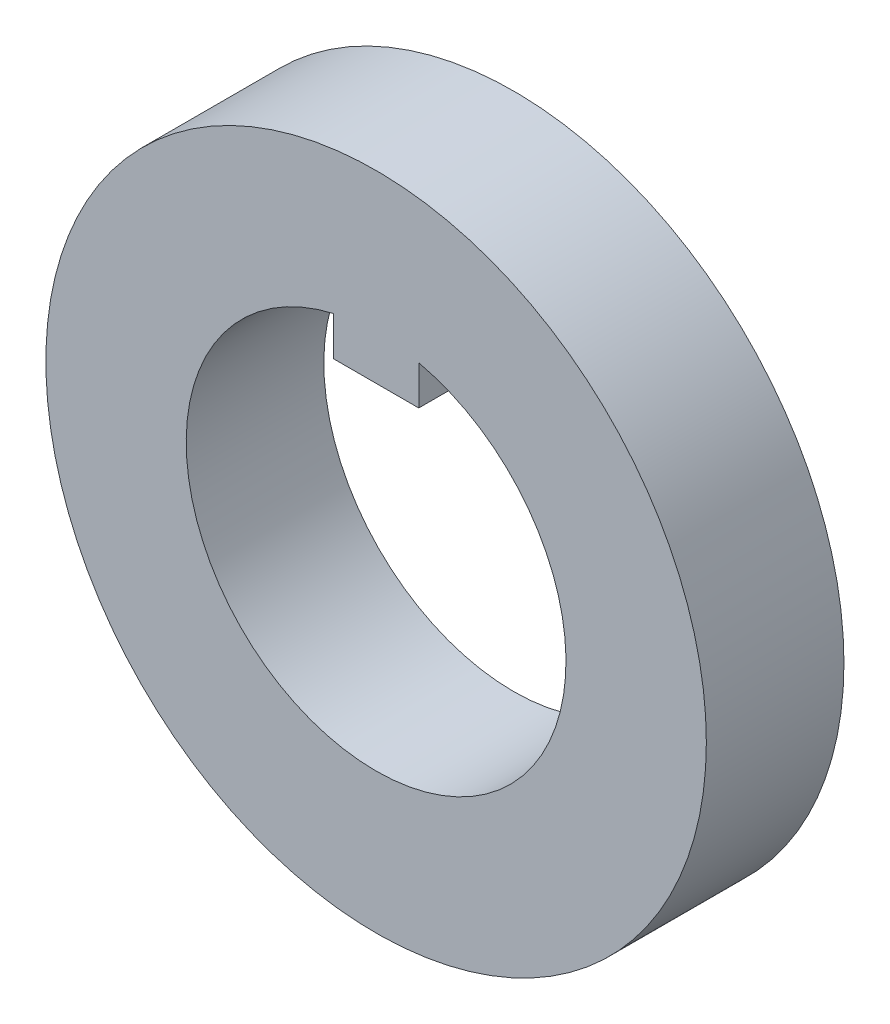
ISO-10303-21;
HEADER;
FILE_DESCRIPTION(('STEP AP214'),'2;1');
FILE_NAME('part.step','',(''),(''),'','','');
FILE_SCHEMA(('AUTOMOTIVE_DESIGN { 1 0 10303 214 1 1 1 1 }'));
ENDSEC;
DATA;
#1=APPLICATION_CONTEXT('core data for automotive mechanical design processes');
#2=APPLICATION_PROTOCOL_DEFINITION('international standard','automotive_design',2000,#1);
#3=PRODUCT_CONTEXT('',#1,'mechanical');
#4=PRODUCT('Part','Part','',(#3));
#5=PRODUCT_RELATED_PRODUCT_CATEGORY('part','',(#4));
#6=PRODUCT_DEFINITION_FORMATION('','',#4);
#7=PRODUCT_DEFINITION_CONTEXT('part definition',#1,'design');
#8=PRODUCT_DEFINITION('design','',#6,#7);
#9=PRODUCT_DEFINITION_SHAPE('','',#8);
#10=(LENGTH_UNIT() NAMED_UNIT(*) SI_UNIT(.MILLI.,.METRE.));
#11=(NAMED_UNIT(*) PLANE_ANGLE_UNIT() SI_UNIT($,.RADIAN.));
#12=(NAMED_UNIT(*) SI_UNIT($,.STERADIAN.) SOLID_ANGLE_UNIT());
#13=UNCERTAINTY_MEASURE_WITH_UNIT(LENGTH_MEASURE(1.E-05),#10,'distance_accuracy_value','');
#14=(GEOMETRIC_REPRESENTATION_CONTEXT(3) GLOBAL_UNCERTAINTY_ASSIGNED_CONTEXT((#13)) GLOBAL_UNIT_ASSIGNED_CONTEXT((#10,
#11,#12)) REPRESENTATION_CONTEXT('',''));
#15=CARTESIAN_POINT('',(0.,0.,0.));
#16=DIRECTION('',(0.,0.,1.));
#17=DIRECTION('',(1.,0.,0.));
#18=AXIS2_PLACEMENT_3D('',#15,#16,#17);
#19=CARTESIAN_POINT('',(0.,0.,12.7));
#20=DIRECTION('',(0.,0.,-1.));
#21=DIRECTION('',(-1.,0.,0.));
#22=AXIS2_PLACEMENT_3D('',#19,#20,#21);
#23=CYLINDRICAL_SURFACE('',#22,17.526);
#24=CARTESIAN_POINT('',(0.,0.,0.));
#25=DIRECTION('',(0.,0.,1.));
#26=DIRECTION('',(1.,0.,0.));
#27=AXIS2_PLACEMENT_3D('',#24,#25,#26);
#28=CIRCLE('',#27,17.526);
#29=CARTESIAN_POINT('',(-3.937,17.078076794534,0.));
#30=VERTEX_POINT('',#29);
#31=CARTESIAN_POINT('',(3.937,17.078076794534,0.));
#32=VERTEX_POINT('',#31);
#33=EDGE_CURVE('E102',#30,#32,#28,.T.);
#34=ORIENTED_EDGE('',*,*,#33,.F.);
#35=DIRECTION('',(0.,0.,-1.));
#36=VECTOR('',#35,1.);
#37=CARTESIAN_POINT('',(-3.937,17.078076794534,12.7));
#38=LINE('',#37,#36);
#39=CARTESIAN_POINT('',(-3.937,17.078076794534,12.7));
#40=VERTEX_POINT('',#39);
#41=EDGE_CURVE('E11',#40,#30,#38,.T.);
#42=ORIENTED_EDGE('',*,*,#41,.F.);
#43=CARTESIAN_POINT('',(0.,0.,12.7));
#44=DIRECTION('',(0.,0.,1.));
#45=DIRECTION('',(1.,0.,0.));
#46=AXIS2_PLACEMENT_3D('',#43,#44,#45);
#47=CIRCLE('',#46,17.526);
#48=CARTESIAN_POINT('',(3.937,17.078076794534,12.7));
#49=VERTEX_POINT('',#48);
#50=EDGE_CURVE('E84',#40,#49,#47,.T.);
#51=ORIENTED_EDGE('',*,*,#50,.T.);
#52=DIRECTION('',(0.,0.,-1.));
#53=VECTOR('',#52,1.);
#54=CARTESIAN_POINT('',(3.937,17.078076794534,12.7));
#55=LINE('',#54,#53);
#56=EDGE_CURVE('E51',#49,#32,#55,.T.);
#57=ORIENTED_EDGE('',*,*,#56,.T.);
#58=EDGE_LOOP('',(#34,#42,#51,#57));
#59=FACE_BOUND('',#58,.T.);
#60=ADVANCED_FACE('F35',(#59),#23,.F.);
#61=CARTESIAN_POINT('',(-3.937,0.,12.7));
#62=DIRECTION('',(1.,0.,0.));
#63=DIRECTION('',(0.,1.,0.));
#64=AXIS2_PLACEMENT_3D('',#61,#62,#63);
#65=PLANE('',#64);
#66=DIRECTION('',(0.,-1.,0.));
#67=VECTOR('',#66,1.);
#68=CARTESIAN_POINT('',(-3.937,0.,0.));
#69=LINE('',#68,#67);
#70=CARTESIAN_POINT('',(-3.937,13.462,0.));
#71=VERTEX_POINT('',#70);
#72=EDGE_CURVE('E90',#30,#71,#69,.T.);
#73=ORIENTED_EDGE('',*,*,#72,.T.);
#74=DIRECTION('',(0.,0.,-1.));
#75=VECTOR('',#74,1.);
#76=CARTESIAN_POINT('',(-3.937,13.462,12.7));
#77=LINE('',#76,#75);
#78=CARTESIAN_POINT('',(-3.937,13.462,12.7));
#79=VERTEX_POINT('',#78);
#80=EDGE_CURVE('E43',#79,#71,#77,.T.);
#81=ORIENTED_EDGE('',*,*,#80,.F.);
#82=DIRECTION('',(0.,-1.,0.));
#83=VECTOR('',#82,1.);
#84=CARTESIAN_POINT('',(-3.937,0.,12.7));
#85=LINE('',#84,#83);
#86=EDGE_CURVE('E77',#40,#79,#85,.T.);
#87=ORIENTED_EDGE('',*,*,#86,.F.);
#88=ORIENTED_EDGE('',*,*,#41,.T.);
#89=EDGE_LOOP('',(#73,#81,#87,#88));
#90=FACE_BOUND('',#89,.T.);
#91=ADVANCED_FACE('F88',(#90),#65,.F.);
#92=CARTESIAN_POINT('',(0.,13.462,12.7));
#93=DIRECTION('',(0.,1.,0.));
#94=DIRECTION('',(0.,0.,1.));
#95=AXIS2_PLACEMENT_3D('',#92,#93,#94);
#96=PLANE('',#95);
#97=DIRECTION('',(1.,0.,0.));
#98=VECTOR('',#97,1.);
#99=CARTESIAN_POINT('',(0.,13.462,0.));
#100=LINE('',#99,#98);
#101=CARTESIAN_POINT('',(3.937,13.462,0.));
#102=VERTEX_POINT('',#101);
#103=EDGE_CURVE('E105',#71,#102,#100,.T.);
#104=ORIENTED_EDGE('',*,*,#103,.T.);
#105=DIRECTION('',(0.,0.,-1.));
#106=VECTOR('',#105,1.);
#107=CARTESIAN_POINT('',(3.937,13.462,12.7));
#108=LINE('',#107,#106);
#109=CARTESIAN_POINT('',(3.937,13.462,12.7));
#110=VERTEX_POINT('',#109);
#111=EDGE_CURVE('E65',#110,#102,#108,.T.);
#112=ORIENTED_EDGE('',*,*,#111,.F.);
#113=DIRECTION('',(1.,0.,0.));
#114=VECTOR('',#113,1.);
#115=CARTESIAN_POINT('',(0.,13.462,12.7));
#116=LINE('',#115,#114);
#117=EDGE_CURVE('E83',#79,#110,#116,.T.);
#118=ORIENTED_EDGE('',*,*,#117,.F.);
#119=ORIENTED_EDGE('',*,*,#80,.T.);
#120=EDGE_LOOP('',(#104,#112,#118,#119));
#121=FACE_BOUND('',#120,.T.);
#122=ADVANCED_FACE('F93',(#121),#96,.F.);
#123=CARTESIAN_POINT('',(3.937,0.,12.7));
#124=DIRECTION('',(1.,0.,0.));
#125=DIRECTION('',(0.,1.,0.));
#126=AXIS2_PLACEMENT_3D('',#123,#124,#125);
#127=PLANE('',#126);
#128=DIRECTION('',(0.,-1.,0.));
#129=VECTOR('',#128,1.);
#130=CARTESIAN_POINT('',(3.937,0.,0.));
#131=LINE('',#130,#129);
#132=EDGE_CURVE('E107',#32,#102,#131,.T.);
#133=ORIENTED_EDGE('',*,*,#132,.F.);
#134=ORIENTED_EDGE('',*,*,#56,.F.);
#135=DIRECTION('',(0.,-1.,0.));
#136=VECTOR('',#135,1.);
#137=CARTESIAN_POINT('',(3.937,0.,12.7));
#138=LINE('',#137,#136);
#139=EDGE_CURVE('E94',#49,#110,#138,.T.);
#140=ORIENTED_EDGE('',*,*,#139,.T.);
#141=ORIENTED_EDGE('',*,*,#111,.T.);
#142=EDGE_LOOP('',(#133,#134,#140,#141));
#143=FACE_BOUND('',#142,.T.);
#144=ADVANCED_FACE('F116',(#143),#127,.T.);
#145=CARTESIAN_POINT('',(0.,0.,12.7));
#146=DIRECTION('',(0.,0.,-1.));
#147=DIRECTION('',(-1.,0.,0.));
#148=AXIS2_PLACEMENT_3D('',#145,#146,#147);
#149=CYLINDRICAL_SURFACE('',#148,30.48);
#150=CARTESIAN_POINT('',(0.,0.,12.7));
#151=DIRECTION('',(0.,0.,1.));
#152=DIRECTION('',(1.,0.,0.));
#153=AXIS2_PLACEMENT_3D('',#150,#151,#152);
#154=CIRCLE('',#153,30.48);
#155=CARTESIAN_POINT('',(30.48,0.,12.7));
#156=VERTEX_POINT('',#155);
#157=EDGE_CURVE('E96',#156,#156,#154,.T.);
#158=ORIENTED_EDGE('',*,*,#157,.F.);
#159=EDGE_LOOP('',(#158));
#160=FACE_BOUND('',#159,.T.);
#161=CARTESIAN_POINT('',(0.,0.,0.));
#162=DIRECTION('',(0.,0.,1.));
#163=DIRECTION('',(1.,0.,0.));
#164=AXIS2_PLACEMENT_3D('',#161,#162,#163);
#165=CIRCLE('',#164,30.48);
#166=CARTESIAN_POINT('',(30.48,0.,0.));
#167=VERTEX_POINT('',#166);
#168=EDGE_CURVE('E110',#167,#167,#165,.T.);
#169=ORIENTED_EDGE('',*,*,#168,.T.);
#170=EDGE_LOOP('',(#169));
#171=FACE_BOUND('',#170,.T.);
#172=ADVANCED_FACE('F118',(#160,#171),#149,.T.);
#173=CARTESIAN_POINT('',(0.,0.,12.7));
#174=DIRECTION('',(0.,0.,1.));
#175=DIRECTION('',(1.,0.,0.));
#176=AXIS2_PLACEMENT_3D('',#173,#174,#175);
#177=PLANE('',#176);
#178=ORIENTED_EDGE('',*,*,#50,.F.);
#179=ORIENTED_EDGE('',*,*,#86,.T.);
#180=ORIENTED_EDGE('',*,*,#117,.T.);
#181=ORIENTED_EDGE('',*,*,#139,.F.);
#182=EDGE_LOOP('',(#178,#179,#180,#181));
#183=FACE_BOUND('',#182,.T.);
#184=ORIENTED_EDGE('',*,*,#157,.T.);
#185=EDGE_LOOP('',(#184));
#186=FACE_BOUND('',#185,.T.);
#187=ADVANCED_FACE('F79',(#183,#186),#177,.T.);
#188=CARTESIAN_POINT('',(0.,0.,0.));
#189=DIRECTION('',(0.,0.,1.));
#190=DIRECTION('',(1.,0.,0.));
#191=AXIS2_PLACEMENT_3D('',#188,#189,#190);
#192=PLANE('',#191);
#193=ORIENTED_EDGE('',*,*,#33,.T.);
#194=ORIENTED_EDGE('',*,*,#132,.T.);
#195=ORIENTED_EDGE('',*,*,#103,.F.);
#196=ORIENTED_EDGE('',*,*,#72,.F.);
#197=EDGE_LOOP('',(#193,#194,#195,#196));
#198=FACE_BOUND('',#197,.T.);
#199=ORIENTED_EDGE('',*,*,#168,.F.);
#200=EDGE_LOOP('',(#199));
#201=FACE_BOUND('',#200,.T.);
#202=ADVANCED_FACE('F157',(#198,#201),#192,.F.);
#203=CLOSED_SHELL('',(#60,#91,#122,#144,#172,#187,#202));
#204=MANIFOLD_SOLID_BREP('B2',#203);
#205=ADVANCED_BREP_SHAPE_REPRESENTATION('',(#18,#204),#14);
#206=SHAPE_DEFINITION_REPRESENTATION(#9,#205);
ENDSEC;
END-ISO-10303-21;
